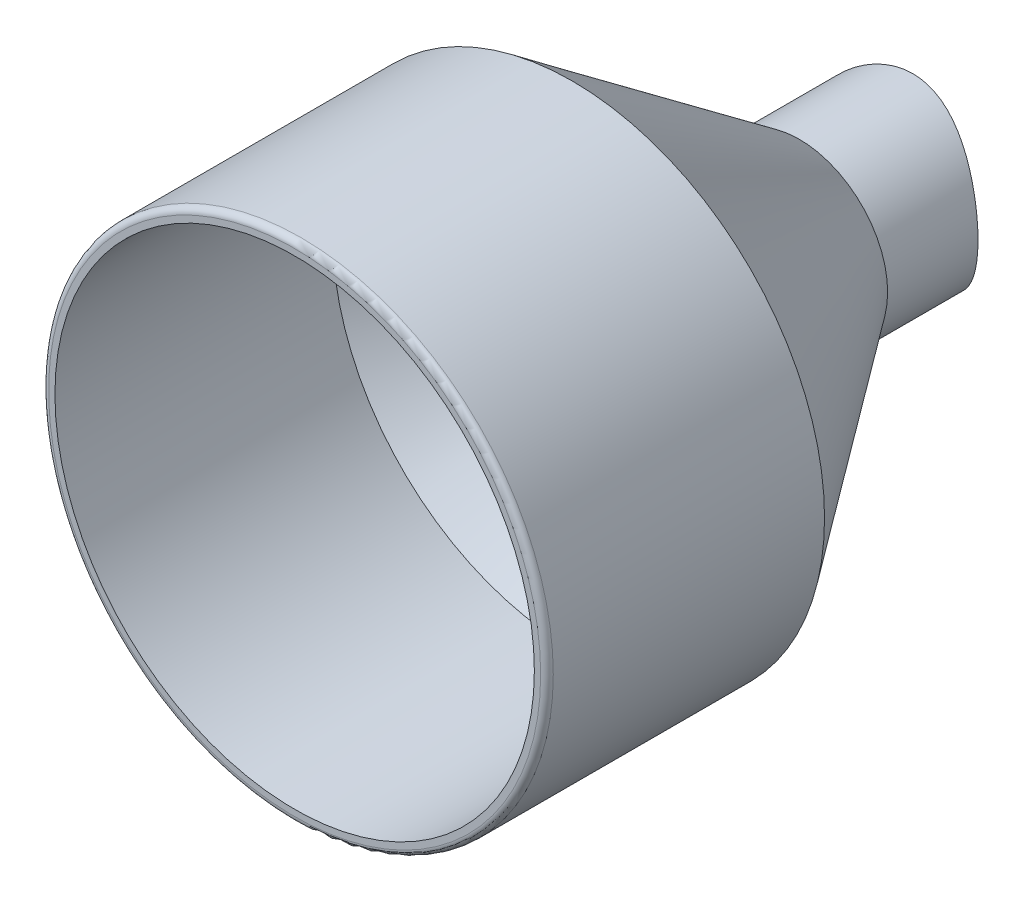
ISO-10303-21;
HEADER;
FILE_DESCRIPTION(('STEP AP214'),'2;1');
FILE_NAME('part.step','',(''),(''),'','','');
FILE_SCHEMA(('AUTOMOTIVE_DESIGN { 1 0 10303 214 1 1 1 1 }'));
ENDSEC;
DATA;
#1=APPLICATION_CONTEXT('core data for automotive mechanical design processes');
#2=APPLICATION_PROTOCOL_DEFINITION('international standard','automotive_design',2000,#1);
#3=PRODUCT_CONTEXT('',#1,'mechanical');
#4=PRODUCT('Part','Part','',(#3));
#5=PRODUCT_RELATED_PRODUCT_CATEGORY('part','',(#4));
#6=PRODUCT_DEFINITION_FORMATION('','',#4);
#7=PRODUCT_DEFINITION_CONTEXT('part definition',#1,'design');
#8=PRODUCT_DEFINITION('design','',#6,#7);
#9=PRODUCT_DEFINITION_SHAPE('','',#8);
#10=(LENGTH_UNIT() NAMED_UNIT(*) SI_UNIT(.MILLI.,.METRE.));
#11=(NAMED_UNIT(*) PLANE_ANGLE_UNIT() SI_UNIT($,.RADIAN.));
#12=(NAMED_UNIT(*) SI_UNIT($,.STERADIAN.) SOLID_ANGLE_UNIT());
#13=UNCERTAINTY_MEASURE_WITH_UNIT(LENGTH_MEASURE(1.E-05),#10,'distance_accuracy_value','');
#14=(GEOMETRIC_REPRESENTATION_CONTEXT(3) GLOBAL_UNCERTAINTY_ASSIGNED_CONTEXT((#13)) GLOBAL_UNIT_ASSIGNED_CONTEXT((#10,
#11,#12)) REPRESENTATION_CONTEXT('',''));
#15=CARTESIAN_POINT('',(0.,0.,0.));
#16=DIRECTION('',(0.,0.,1.));
#17=DIRECTION('',(1.,0.,0.));
#18=AXIS2_PLACEMENT_3D('',#15,#16,#17);
#19=CARTESIAN_POINT('',(0.,0.,0.));
#20=DIRECTION('',(0.,0.,1.));
#21=DIRECTION('',(1.,0.,0.));
#22=AXIS2_PLACEMENT_3D('',#19,#20,#21);
#23=CYLINDRICAL_SURFACE('',#22,6.);
#24=CARTESIAN_POINT('',(0.,0.,-18.));
#25=DIRECTION('',(0.,0.,1.));
#26=DIRECTION('',(1.,0.,0.));
#27=AXIS2_PLACEMENT_3D('',#24,#25,#26);
#28=CIRCLE('',#27,6.);
#29=CARTESIAN_POINT('',(-5.91607978309961,-0.999999999999999,-18.));
#30=VERTEX_POINT('',#29);
#31=CARTESIAN_POINT('',(5.91607978309961,-1.,-18.));
#32=VERTEX_POINT('',#31);
#33=EDGE_CURVE('E230',#30,#32,#28,.T.);
#34=ORIENTED_EDGE('',*,*,#33,.T.);
#35=DIRECTION('',(0.,0.,1.));
#36=VECTOR('',#35,1.);
#37=CARTESIAN_POINT('',(5.91607978309962,-1.,0.));
#38=LINE('',#37,#36);
#39=CARTESIAN_POINT('',(5.91607978309962,-1.,-21.9160797830994));
#40=VERTEX_POINT('',#39);
#41=EDGE_CURVE('E152',#32,#40,#38,.F.);
#42=ORIENTED_EDGE('',*,*,#41,.T.);
#43=CARTESIAN_POINT('',(0.,0.,-15.9999999999998));
#44=DIRECTION('',(0.70710678118655,0.,0.707106781186545));
#45=DIRECTION('',(-0.707106781186545,0.,0.70710678118655));
#46=AXIS2_PLACEMENT_3D('',#43,#44,#45);
#47=ELLIPSE('',#46,8.4852813742386,6.);
#48=CARTESIAN_POINT('',(6.00000000000019,0.,-22.));
#49=VERTEX_POINT('',#48);
#50=EDGE_CURVE('E11',#40,#49,#47,.T.);
#51=ORIENTED_EDGE('',*,*,#50,.T.);
#52=CARTESIAN_POINT('',(0.,0.,-15.9999999999998));
#53=DIRECTION('',(0.70710678118655,0.,0.707106781186545));
#54=DIRECTION('',(-0.707106781186545,0.,0.70710678118655));
#55=AXIS2_PLACEMENT_3D('',#52,#53,#54);
#56=ELLIPSE('',#55,8.4852813742386,6.);
#57=CARTESIAN_POINT('',(5.91607978309962,1.,-21.9160797830994));
#58=VERTEX_POINT('',#57);
#59=EDGE_CURVE('E58',#49,#58,#56,.T.);
#60=ORIENTED_EDGE('',*,*,#59,.T.);
#61=DIRECTION('',(0.,0.,1.));
#62=VECTOR('',#61,1.);
#63=CARTESIAN_POINT('',(5.91607978309962,1.,0.));
#64=LINE('',#63,#62);
#65=CARTESIAN_POINT('',(5.91607978309961,1.,-18.));
#66=VERTEX_POINT('',#65);
#67=EDGE_CURVE('E150',#66,#58,#64,.F.);
#68=ORIENTED_EDGE('',*,*,#67,.F.);
#69=CARTESIAN_POINT('',(-5.91607978309961,1.,-18.));
#70=VERTEX_POINT('',#69);
#71=EDGE_CURVE('E229',#66,#70,#28,.T.);
#72=ORIENTED_EDGE('',*,*,#71,.T.);
#73=DIRECTION('',(0.,0.,1.));
#74=VECTOR('',#73,1.);
#75=CARTESIAN_POINT('',(-5.91607978309962,1.,0.));
#76=LINE('',#75,#74);
#77=CARTESIAN_POINT('',(-5.91607978309962,1.,-21.9160797830994));
#78=VERTEX_POINT('',#77);
#79=EDGE_CURVE('E170',#70,#78,#76,.F.);
#80=ORIENTED_EDGE('',*,*,#79,.T.);
#81=CARTESIAN_POINT('',(0.,0.,-15.9999999999998));
#82=DIRECTION('',(0.707106781186545,0.,-0.70710678118655));
#83=DIRECTION('',(0.70710678118655,0.,0.707106781186545));
#84=AXIS2_PLACEMENT_3D('',#81,#82,#83);
#85=ELLIPSE('',#84,8.48528137423854,6.);
#86=CARTESIAN_POINT('',(-6.0000000000002,0.,-22.));
#87=VERTEX_POINT('',#86);
#88=EDGE_CURVE('E70',#78,#87,#85,.F.);
#89=ORIENTED_EDGE('',*,*,#88,.T.);
#90=CARTESIAN_POINT('',(0.,0.,-15.9999999999998));
#91=DIRECTION('',(0.707106781186545,0.,-0.70710678118655));
#92=DIRECTION('',(0.70710678118655,0.,0.707106781186545));
#93=AXIS2_PLACEMENT_3D('',#90,#91,#92);
#94=ELLIPSE('',#93,8.48528137423854,6.);
#95=CARTESIAN_POINT('',(-5.91607978309962,-0.999999999999999,-21.9160797830994));
#96=VERTEX_POINT('',#95);
#97=EDGE_CURVE('E278',#87,#96,#94,.F.);
#98=ORIENTED_EDGE('',*,*,#97,.T.);
#99=DIRECTION('',(0.,0.,1.));
#100=VECTOR('',#99,1.);
#101=CARTESIAN_POINT('',(-5.91607978309962,-0.999999999999999,0.));
#102=LINE('',#101,#100);
#103=EDGE_CURVE('E166',#30,#96,#102,.F.);
#104=ORIENTED_EDGE('',*,*,#103,.F.);
#105=EDGE_LOOP('',(#34,#42,#51,#60,#68,#72,#80,#89,#98,#104));
#106=FACE_BOUND('',#105,.T.);
#107=CARTESIAN_POINT('',(6.,0.,-25.1621915873063));
#108=CARTESIAN_POINT('',(5.99999888257323,0.160618394721495,-25.1621924892069));
#109=CARTESIAN_POINT('',(5.99354173824392,0.321289035599812,-25.1649145803394));
#110=CARTESIAN_POINT('',(5.96777370903568,0.641484455748276,-25.1757352147799));
#111=CARTESIAN_POINT('',(5.94845481198529,0.801008458073393,-25.1838371094043));
#112=CARTESIAN_POINT('',(5.89711273169944,1.11798337683559,-25.2052252391968));
#113=CARTESIAN_POINT('',(5.86506384340159,1.27542942860917,-25.2185219631379));
#114=CARTESIAN_POINT('',(5.78857746660142,1.58685012186932,-25.2499560807362));
#115=CARTESIAN_POINT('',(5.7441349145943,1.74082331664972,-25.2680954527563));
#116=CARTESIAN_POINT('',(5.64349000112519,2.04361840661437,-25.3086683322806));
#117=CARTESIAN_POINT('',(5.58733365890612,2.19245787995398,-25.3310850072676));
#118=CARTESIAN_POINT('',(5.4636306092057,2.48474093471054,-25.3797105048604));
#119=CARTESIAN_POINT('',(5.39607964159631,2.62818247336909,-25.4059207452508));
#120=CARTESIAN_POINT('',(5.25018391014092,2.90870044118946,-25.4614789078839));
#121=CARTESIAN_POINT('',(5.17184696919005,3.0457813881113,-25.4908245526431));
#122=CARTESIAN_POINT('',(5.00489817164606,3.3129809410029,-25.5519794431593));
#123=CARTESIAN_POINT('',(4.91628258597859,3.44309699494336,-25.5837895816317));
#124=CARTESIAN_POINT('',(4.62720337107324,3.83366084023144,-25.6848521329039));
#125=CARTESIAN_POINT('',(4.41021496961765,4.0813806819033,-25.7570816531876));
#126=CARTESIAN_POINT('',(3.93867576395821,4.53813343285698,-25.9019931919335));
#127=CARTESIAN_POINT('',(3.68410492395575,4.74714557161794,-25.9746754318286));
#128=CARTESIAN_POINT('',(3.27155115657071,5.03258230756573,-26.0800265078064));
#129=CARTESIAN_POINT('',(3.12500305472979,5.12488363137657,-26.1153274431481));
#130=CARTESIAN_POINT('',(2.82395816976248,5.29672182916938,-26.1828396494125));
#131=CARTESIAN_POINT('',(2.66946471609206,5.37626399317016,-26.2150521985571));
#132=CARTESIAN_POINT('',(2.35347944858144,5.52190245446403,-26.2753231511987));
#133=CARTESIAN_POINT('',(2.1919873724393,5.58799824726991,-26.303381398822));
#134=CARTESIAN_POINT('',(1.86320293959396,5.70604582695153,-26.3543327395146));
#135=CARTESIAN_POINT('',(1.69591363653532,5.75800493628933,-26.3772285055687));
#136=CARTESIAN_POINT('',(1.36497441566996,5.84505656806531,-26.4160392656105));
#137=CARTESIAN_POINT('',(1.20154069472106,5.88084414741359,-26.432238667914));
#138=CARTESIAN_POINT('',(0.871848156796185,5.9386760916095,-26.4585959387235));
#139=CARTESIAN_POINT('',(0.705590690680889,5.96072684784478,-26.4687566167901));
#140=CARTESIAN_POINT('',(0.37158988082561,5.9908287838777,-26.4826615560872));
#141=CARTESIAN_POINT('',(0.203846952412823,5.99888375988389,-26.4864075572277));
#142=CARTESIAN_POINT('',(-0.131737395549293,6.0008995803368,-26.4873431339011));
#143=CARTESIAN_POINT('',(-0.299578809252229,5.99486119052214,-26.4845330656467));
#144=CARTESIAN_POINT('',(-0.620727249036738,5.96980389497806,-26.4729447644338));
#145=CARTESIAN_POINT('',(-0.774136246005555,5.95184667719619,-26.4646548830236));
#146=CARTESIAN_POINT('',(-1.07880348065238,5.90423253859485,-26.4428730495754));
#147=CARTESIAN_POINT('',(-1.23006099964038,5.87457179914799,-26.4293793996834));
#148=CARTESIAN_POINT('',(-1.52933353764565,5.80385882262908,-26.3976143249487));
#149=CARTESIAN_POINT('',(-1.67734927552561,5.76280913921561,-26.3793439712039));
#150=CARTESIAN_POINT('',(-1.96932421660252,5.6696784486531,-26.3385605524084));
#151=CARTESIAN_POINT('',(-2.11328182995331,5.61759318433394,-26.3160458503961));
#152=CARTESIAN_POINT('',(-2.39926082527226,5.50162302834155,-26.2669000077499));
#153=CARTESIAN_POINT('',(-2.54117742362295,5.43751254794415,-26.2401920981847));
#154=CARTESIAN_POINT('',(-2.81916924800812,5.29871973177929,-26.1837494809403));
#155=CARTESIAN_POINT('',(-2.95524248248552,5.2240338283464,-26.1540137527681));
#156=CARTESIAN_POINT('',(-3.22084718795343,5.06459661420295,-26.0922941789663));
#157=CARTESIAN_POINT('',(-3.35037767439956,4.97984379502881,-26.0603099967139));
#158=CARTESIAN_POINT('',(-3.60227159990305,4.80078338674564,-25.9948869382663));
#159=CARTESIAN_POINT('',(-3.72463462774758,4.70647525027275,-25.9614479787987));
#160=CARTESIAN_POINT('',(-3.97190577179377,4.50023124980554,-25.8909749997068));
#161=CARTESIAN_POINT('',(-4.09611436849253,4.38747593919586,-25.8538806912834));
#162=CARTESIAN_POINT('',(-4.33465624066508,4.15196824278665,-25.7799178433171));
#163=CARTESIAN_POINT('',(-4.44899234038658,4.02921873570357,-25.7430492420285));
#164=CARTESIAN_POINT('',(-4.66721335912174,3.77429288747005,-25.670474654568));
#165=CARTESIAN_POINT('',(-4.77109177531276,3.64211076713233,-25.6347694010104));
#166=CARTESIAN_POINT('',(-4.96758611954717,3.36917676549167,-25.5654966449016));
#167=CARTESIAN_POINT('',(-5.06020654608414,3.22842834109494,-25.5319282910538));
#168=CARTESIAN_POINT('',(-5.23567474441132,2.93556755749549,-25.4670138714965));
#169=CARTESIAN_POINT('',(-5.31822673111419,2.78326102948591,-25.4357426065437));
#170=CARTESIAN_POINT('',(-5.47007590092039,2.47150122265009,-25.3772594225084));
#171=CARTESIAN_POINT('',(-5.53937847614665,2.31205088389665,-25.3500458530592));
#172=CARTESIAN_POINT('',(-5.66406925926004,1.98710703950235,-25.3004621673943));
#173=CARTESIAN_POINT('',(-5.71946079594547,1.82161499047062,-25.2780908926341));
#174=CARTESIAN_POINT('',(-5.81573825822113,1.48582855126444,-25.2388583251554));
#175=CARTESIAN_POINT('',(-5.85662531218667,1.31553453577179,-25.2219966038296));
#176=CARTESIAN_POINT('',(-5.92126122708215,0.982620194032665,-25.1951936944371));
#177=CARTESIAN_POINT('',(-5.94594324203777,0.820210786394779,-25.1848771445674));
#178=CARTESIAN_POINT('',(-5.98191229661552,0.49366220955641,-25.1698074409961));
#179=CARTESIAN_POINT('',(-5.99320008886445,0.329523138069366,-25.1650539747027));
#180=CARTESIAN_POINT('',(-6.00225133900485,0.000847930234132888,-25.1612440895249));
#181=CARTESIAN_POINT('',(-6.00001814978791,-0.163688097562655,-25.1621862582542));
#182=CARTESIAN_POINT('',(-5.98206092912801,-0.49188870700544,-25.1697379306299));
#183=CARTESIAN_POINT('',(-5.96633720942654,-0.655553308700568,-25.1763473033174));
#184=CARTESIAN_POINT('',(-5.92272643781012,-0.972401134376432,-25.1945680170866));
#185=CARTESIAN_POINT('',(-5.89550306406548,-1.12569210609634,-25.2059060563324));
#186=CARTESIAN_POINT('',(-5.82933220918568,-1.42934954081912,-25.2332386626139));
#187=CARTESIAN_POINT('',(-5.79038091516022,-1.57971503576229,-25.2492347439805));
#188=CARTESIAN_POINT('',(-5.70113145919719,-1.87645963469755,-25.2854885412545));
#189=CARTESIAN_POINT('',(-5.65083650994064,-2.02283985424587,-25.3057450504402));
#190=CARTESIAN_POINT('',(-5.53930448713367,-2.31083577626561,-25.350051799416));
#191=CARTESIAN_POINT('',(-5.47806324440901,-2.45244963884182,-25.3741034842848));
#192=CARTESIAN_POINT('',(-5.34308395499758,-2.73434086314345,-25.4262324598577));
#193=CARTESIAN_POINT('',(-5.26901948190859,-2.8744431569949,-25.454410812225));
#194=CARTESIAN_POINT('',(-5.11031466707195,-3.14796687789442,-25.5135444259671));
#195=CARTESIAN_POINT('',(-5.02567070937933,-3.2813859987666,-25.544500635756));
#196=CARTESIAN_POINT('',(-4.84637621523083,-3.54083427912253,-25.6084656889157));
#197=CARTESIAN_POINT('',(-4.75172387000061,-3.66686209638643,-25.6414749028718));
#198=CARTESIAN_POINT('',(-4.55299091707716,-3.91088708997672,-25.7087801278021));
#199=CARTESIAN_POINT('',(-4.44890983939863,-4.02888386547321,-25.7430762028713));
#200=CARTESIAN_POINT('',(-4.22394285067534,-4.26459297728537,-25.8146915355818));
#201=CARTESIAN_POINT('',(-4.10238459583844,-4.38165311514307,-25.8520484233736));
#202=CARTESIAN_POINT('',(-3.84980881751118,-4.60514942627173,-25.9263113821488));
#203=CARTESIAN_POINT('',(-3.71879416817123,-4.71158880434963,-25.9632175861577));
#204=CARTESIAN_POINT('',(-3.44790959463138,-4.91329338653297,-26.0355874421849));
#205=CARTESIAN_POINT('',(-3.30803400785155,-5.00855133193964,-26.0710501474713));
#206=CARTESIAN_POINT('',(-3.02034501474886,-5.18711534327722,-26.1394573032266));
#207=CARTESIAN_POINT('',(-2.87253496321531,-5.27042640663928,-26.1724028039427));
#208=CARTESIAN_POINT('',(-2.56734291931278,-5.42572879108832,-26.2352760733726));
#209=CARTESIAN_POINT('',(-2.40984505419947,-5.49751604118815,-26.2651466503623));
#210=CARTESIAN_POINT('',(-2.08859007123571,-5.62741458469705,-26.320221326049));
#211=CARTESIAN_POINT('',(-1.92483571315456,-5.68553182886954,-26.3454274542292));
#212=CARTESIAN_POINT('',(-1.59227196867133,-5.78747795773815,-26.3902599608757));
#213=CARTESIAN_POINT('',(-1.42346505992841,-5.83131372436167,-26.40988902622));
#214=CARTESIAN_POINT('',(-1.08208515385563,-5.90419726271519,-26.4428214668439));
#215=CARTESIAN_POINT('',(-0.909512523154297,-5.93324646741631,-26.4561254550809));
#216=CARTESIAN_POINT('',(-0.57571514487457,-5.97449411311304,-26.475098034296));
#217=CARTESIAN_POINT('',(-0.414659915951917,-5.98783389817642,-26.4812829236631));
#218=CARTESIAN_POINT('',(-0.0918824167973524,-6.00147028787072,-26.4876059575911));
#219=CARTESIAN_POINT('',(0.0698398183627695,-6.00176756976011,-26.4877444161252));
#220=CARTESIAN_POINT('',(0.392645863967104,-5.98931690970327,-26.4819700697026));
#221=CARTESIAN_POINT('',(0.553729764536217,-5.97657088034601,-26.476058151935));
#222=CARTESIAN_POINT('',(0.874026699084269,-5.938189355622,-26.4583947693117));
#223=CARTESIAN_POINT('',(1.03323975001881,-5.91255397716444,-26.4466433574215));
#224=CARTESIAN_POINT('',(1.3409017611149,-5.85024812984096,-26.4184160557315));
#225=CARTESIAN_POINT('',(1.48949670585988,-5.81417763803819,-26.4021988859659));
#226=CARTESIAN_POINT('',(1.78303863127114,-5.73097339915315,-26.3653332215793));
#227=CARTESIAN_POINT('',(1.92798441704062,-5.68383607915427,-26.3446832960314));
#228=CARTESIAN_POINT('',(2.21333163801387,-5.57891231254692,-26.2995452057887));
#229=CARTESIAN_POINT('',(2.35373366980137,-5.5211272706818,-26.2750575474659));
#230=CARTESIAN_POINT('',(2.62929521173578,-5.39534758087854,-26.2229020794061));
#231=CARTESIAN_POINT('',(2.76445278856944,-5.32734921206336,-26.1952331115328));
#232=CARTESIAN_POINT('',(3.17700913232949,-5.09989962007943,-26.1050059804287));
#233=CARTESIAN_POINT('',(3.44422844864841,-4.92329860741105,-26.0380710826127));
#234=CARTESIAN_POINT('',(3.94663247775839,-4.53054583896789,-25.8999805259257));
#235=CARTESIAN_POINT('',(4.18180565589542,-4.31437990749146,-25.828823360455));
#236=CARTESIAN_POINT('',(4.51499133633917,-3.955281964872,-25.7214831498572));
#237=CARTESIAN_POINT('',(4.62618347832409,-3.82464302959067,-25.6843271696962));
#238=CARTESIAN_POINT('',(4.83717405390478,-3.55403329044994,-25.6117953300013));
#239=CARTESIAN_POINT('',(4.93697658268199,-3.41406586954012,-25.5764188332218));
#240=CARTESIAN_POINT('',(5.12455356492543,-3.12547624944686,-25.5083827124174));
#241=CARTESIAN_POINT('',(5.21231673910645,-2.97684611766543,-25.4757256472434));
#242=CARTESIAN_POINT('',(5.37494445891248,-2.67203875785514,-25.4140893424782));
#243=CARTESIAN_POINT('',(5.44981494500601,-2.51586504832972,-25.385108410692));
#244=CARTESIAN_POINT('',(5.58495449988672,-2.19941546977564,-25.3320490769435));
#245=CARTESIAN_POINT('',(5.64542998715473,-2.03923931480148,-25.307902273226));
#246=CARTESIAN_POINT('',(5.75259885771387,-1.71375128788139,-25.2646657110172));
#247=CARTESIAN_POINT('',(5.79929879341985,-1.54844189907738,-25.245573548703));
#248=CARTESIAN_POINT('',(5.87833572421284,-1.21431980381375,-25.2130353914309));
#249=CARTESIAN_POINT('',(5.91070802177085,-1.04551679300169,-25.1995755233444));
#250=CARTESIAN_POINT('',(5.96085587832045,-0.705474528202967,-25.1786474632555));
#251=CARTESIAN_POINT('',(5.97864206248944,-0.534237140196967,-25.1711749099166));
#252=CARTESIAN_POINT('',(5.99269030885473,-0.302197952350929,-25.1652679980522));
#253=CARTESIAN_POINT('',(5.99543065738449,-0.241799227883774,-25.1641150061289));
#254=CARTESIAN_POINT('',(5.99908571696554,-0.120936137703109,-25.1625766294387));
#255=CARTESIAN_POINT('',(6.00000042070385,-0.0604717717276298,-25.1621912477467));
#256=CARTESIAN_POINT('',(6.,0.,-25.1621915873063));
#257=B_SPLINE_CURVE_WITH_KNOTS('',3,(#107,#108,#109,#110,#111,#112,#113,#114,#115,#116,#117,
#118,#119,#120,#121,#122,#123,#124,#125,#126,#127,#128,#129,#130,#131,#132,#133,#134,#135,#136,
#137,#138,#139,#140,#141,#142,#143,#144,#145,#146,#147,#148,#149,#150,#151,#152,#153,#154,#155,
#156,#157,#158,#159,#160,#161,#162,#163,#164,#165,#166,#167,#168,#169,#170,#171,#172,#173,#174,
#175,#176,#177,#178,#179,#180,#181,#182,#183,#184,#185,#186,#187,#188,#189,#190,#191,#192,#193,
#194,#195,#196,#197,#198,#199,#200,#201,#202,#203,#204,#205,#206,#207,#208,#209,#210,#211,#212,
#213,#214,#215,#216,#217,#218,#219,#220,#221,#222,#223,#224,#225,#226,#227,#228,#229,#230,#231,
#232,#233,#234,#235,#236,#237,#238,#239,#240,#241,#242,#243,#244,#245,#246,#247,#248,#249,#250,
#251,#252,#253,#254,#255,#256),.UNSPECIFIED.,.T.,.F.,(4,2,2,2,2,2,2,2,2,2,2,2,2,2,2,2,2,2,2,2,2,
2,2,2,2,2,2,2,2,2,2,2,2,2,2,2,2,2,2,2,2,2,2,2,2,2,2,2,2,2,2,2,2,2,2,2,2,2,2,2,2,2,2,2,2,2,2,2,2,
2,2,2,2,2,4),(0.,0.481793787115834,0.963887986702552,1.44696064555644,1.93023095648585,
2.411637273441,2.89322397514694,3.37446321175308,3.85587759044769,4.86265673054637,
5.86997455198099,6.39967387648899,6.92915301386807,7.45865201282982,7.98787621961926,
8.49146668244346,8.99482266234038,9.49804209088331,10.0012341785069,10.4647267579433,
10.9283706910501,11.3919107486116,11.855629951578,12.3291242356415,12.8027786373409,
13.2765041029023,13.7502567205663,14.2650935644978,14.7797826365255,15.2947898022038,
15.8095904988607,16.3370311289759,16.8642566471052,17.3913558839923,17.9184141062304,
18.4115729311591,18.9047040439818,19.3977128766698,19.8907103171317,20.358477142414,
20.8263962089222,21.2941829202757,21.7621481812309,22.2445064348996,22.727030006177,
23.2096409314696,23.6922759262731,24.2102156745484,24.72799865921,25.2461159377579,
25.7640158494698,26.2902623846951,26.816279410994,27.3420425851433,27.8677547976862,
28.3523026008932,28.8368252429413,29.3212768478217,29.8057240587006,30.2665153759395,
30.7274556643561,31.1883351848622,31.6493830201894,32.6266547951157,33.6042774042976,
34.130332464775,34.6561977801018,35.1825524453565,35.7086639333333,36.2267026932479,
36.7444946464434,37.2610035894312,37.7771359491564,37.9585274221562,38.1399196217531),.UNSPECIFIED.);
#258=CARTESIAN_POINT('',(6.,0.,-25.1621915873063));
#259=VERTEX_POINT('',#258);
#260=EDGE_CURVE('E172',#259,#259,#257,.T.);
#261=ORIENTED_EDGE('',*,*,#260,.F.);
#262=EDGE_LOOP('',(#261));
#263=FACE_BOUND('',#262,.T.);
#264=ADVANCED_FACE('F49',(#106,#263),#23,.F.);
#265=CARTESIAN_POINT('',(0.,0.,0.));
#266=DIRECTION('',(0.,0.,1.));
#267=DIRECTION('',(1.,0.,0.));
#268=AXIS2_PLACEMENT_3D('',#265,#266,#267);
#269=CYLINDRICAL_SURFACE('',#268,7.);
#270=CARTESIAN_POINT('',(0.,0.,-18.));
#271=DIRECTION('',(0.,0.,1.));
#272=DIRECTION('',(1.,0.,0.));
#273=AXIS2_PLACEMENT_3D('',#270,#271,#272);
#274=CIRCLE('',#273,7.);
#275=CARTESIAN_POINT('',(7.,0.,-18.));
#276=VERTEX_POINT('',#275);
#277=EDGE_CURVE('E223',#276,#276,#274,.T.);
#278=ORIENTED_EDGE('',*,*,#277,.F.);
#279=EDGE_LOOP('',(#278));
#280=FACE_BOUND('',#279,.T.);
#281=CARTESIAN_POINT('',(0.,7.00000000000018,-27.));
#282=CARTESIAN_POINT('',(-0.182957806975727,6.99999897547508,-26.9999986886827));
#283=CARTESIAN_POINT('',(-0.365937403076251,6.99281736130515,-26.9959408494774));
#284=CARTESIAN_POINT('',(-0.730496169201662,6.96418208123113,-26.9798575248853));
#285=CARTESIAN_POINT('',(-0.912074612894971,6.94272145816514,-26.9678281555412));
#286=CARTESIAN_POINT('',(-1.2726507814891,6.88576273342859,-26.9362214547992));
#287=CARTESIAN_POINT('',(-1.45164378800497,6.85024167842352,-26.916631782694));
#288=CARTESIAN_POINT('',(-1.80554607432146,6.76558419496202,-26.8705932905129));
#289=CARTESIAN_POINT('',(-1.98045355010654,6.71644187064965,-26.8441415005434));
#290=CARTESIAN_POINT('',(-2.32404054906827,6.60539477727641,-26.7854273557382));
#291=CARTESIAN_POINT('',(-2.49274969539304,6.54356374336255,-26.7531987018785));
#292=CARTESIAN_POINT('',(-2.82408771977422,6.4075458589054,-26.6838104440154));
#293=CARTESIAN_POINT('',(-2.98671421931901,6.33335423556397,-26.6466489364187));
#294=CARTESIAN_POINT('',(-3.46410862668851,6.09316611887709,-26.5293522596935));
#295=CARTESIAN_POINT('',(-3.76872799322188,5.90944646344311,-26.4433440189273));
#296=CARTESIAN_POINT('',(-4.36815154354682,5.48318362298563,-26.2571364716684));
#297=CARTESIAN_POINT('',(-4.66025259478686,5.23712636507598,-26.1563525908394));
#298=CARTESIAN_POINT('',(-5.20127844823751,4.70018742018018,-25.956613651358));
#299=CARTESIAN_POINT('',(-5.4501823422764,4.40928415486391,-25.8576594989136));
#300=CARTESIAN_POINT('',(-5.793685567927,3.93381121636027,-25.7148357114364));
#301=CARTESIAN_POINT('',(-5.90605321596001,3.76304498682515,-25.6668265803826));
#302=CARTESIAN_POINT('',(-6.11586871545516,3.41145103173321,-25.5753774392804));
#303=CARTESIAN_POINT('',(-6.21332290367891,3.23062762427275,-25.5319354910956));
#304=CARTESIAN_POINT('',(-6.39235749384011,2.86008840317237,-25.4508748418813));
#305=CARTESIAN_POINT('',(-6.47394153818342,2.67037464241805,-25.4132548050531));
#306=CARTESIAN_POINT('',(-6.62034561154186,2.28337586039313,-25.344950219327));
#307=CARTESIAN_POINT('',(-6.68516734924687,2.08609161318727,-25.3142649635624));
#308=CARTESIAN_POINT('',(-6.79334801195052,1.69938446329013,-25.2626339993837));
#309=CARTESIAN_POINT('',(-6.83788004794211,1.51035962638368,-25.2411620058716));
#310=CARTESIAN_POINT('',(-6.91115588833501,1.12858160518104,-25.2056598010453));
#311=CARTESIAN_POINT('',(-6.93990035919214,0.935828578622192,-25.1916292755981));
#312=CARTESIAN_POINT('',(-6.98121367669525,0.548281933423637,-25.1714219551682));
#313=CARTESIAN_POINT('',(-6.99379044731499,0.353489361619496,-25.1652413128864));
#314=CARTESIAN_POINT('',(-7.00262157421757,-0.0365500547632827,-25.1609042060966));
#315=CARTESIAN_POINT('',(-6.99887688396689,-0.231796872139844,-25.1627472728599));
#316=CARTESIAN_POINT('',(-6.97612449781331,-0.604626993150835,-25.1739076378591));
#317=CARTESIAN_POINT('',(-6.95843028832179,-0.782311616157891,-25.1825816610068));
#318=CARTESIAN_POINT('',(-6.90959783735846,-1.13544642582217,-25.2063974529253));
#319=CARTESIAN_POINT('',(-6.87845503114082,-1.31089583296355,-25.2215414177162));
#320=CARTESIAN_POINT('',(-6.80307344887204,-1.65824182900574,-25.2579264887993));
#321=CARTESIAN_POINT('',(-6.75883923546341,-1.83013963342505,-25.2791654707662));
#322=CARTESIAN_POINT('',(-6.65769862570609,-2.16942432135046,-25.3272537769115));
#323=CARTESIAN_POINT('',(-6.60078730398859,-2.3368094231472,-25.3541052814424));
#324=CARTESIAN_POINT('',(-6.47395202397873,-2.66830768150953,-25.4132144719241));
#325=CARTESIAN_POINT('',(-6.40385970334112,-2.83234406604418,-25.4455414971491));
#326=CARTESIAN_POINT('',(-6.2517826745092,-3.15386642335523,-25.5146122065581));
#327=CARTESIAN_POINT('',(-6.16979395621284,-3.31135016420558,-25.5513573793165));
#328=CARTESIAN_POINT('',(-5.9069148200452,-3.7727380089355,-25.6670375762751));
#329=CARTESIAN_POINT('',(-5.70903558913878,-4.06577521508644,-25.7514537568071));
#330=CARTESIAN_POINT('',(-5.25275153207093,-4.64285723094897,-25.9360458796941));
#331=CARTESIAN_POINT('',(-4.99045159887072,-4.92359029031823,-26.0369572363125));
#332=CARTESIAN_POINT('',(-4.56540488138693,-5.30978735567258,-26.1876735015548));
#333=CARTESIAN_POINT('',(-4.41833905239788,-5.43277867853638,-26.2378397282015));
#334=CARTESIAN_POINT('',(-4.11423602126707,-5.66655295020354,-26.3366894013261));
#335=CARTESIAN_POINT('',(-3.95719729860382,-5.77733403028945,-26.3853726200143));
#336=CARTESIAN_POINT('',(-3.62422142526221,-5.99221245225355,-26.4827430172549));
#337=CARTESIAN_POINT('',(-3.44771570663498,-6.09550926812534,-26.5312549722043));
#338=CARTESIAN_POINT('',(-3.08541881097416,-6.28666151857386,-26.6234603702677));
#339=CARTESIAN_POINT('',(-2.89963186445965,-6.37452390737648,-26.6671559801392));
#340=CARTESIAN_POINT('',(-2.51994869562031,-6.53392861692989,-26.748137216865));
#341=CARTESIAN_POINT('',(-2.32605716566193,-6.60548023051342,-26.7854264906398));
#342=CARTESIAN_POINT('',(-1.93146661519693,-6.73144187542298,-26.8521246334104));
#343=CARTESIAN_POINT('',(-1.73076849240471,-6.78585415757406,-26.8815345370897));
#344=CARTESIAN_POINT('',(-1.34015012033759,-6.87319865491972,-26.9292464822077));
#345=CARTESIAN_POINT('',(-1.15061512892647,-6.90747835171,-26.9482375529786));
#346=CARTESIAN_POINT('',(-0.768706831083227,-6.960333415649,-26.9776758535897));
#347=CARTESIAN_POINT('',(-0.576333681987263,-6.97890965003163,-26.9881235552421));
#348=CARTESIAN_POINT('',(-0.190539011764173,-7.00007122416835,-27.0000341872012));
#349=CARTESIAN_POINT('',(0.00288186410680259,-7.00266548569128,-27.0015021303608));
#350=CARTESIAN_POINT('',(0.389124663262615,-6.99184525542565,-26.9954029375839));
#351=CARTESIAN_POINT('',(0.581946622973794,-6.9784317571385,-26.9878363623634));
#352=CARTESIAN_POINT('',(0.945298776399229,-6.93803050138765,-26.9652362703616));
#353=CARTESIAN_POINT('',(1.11605921770747,-6.91260187136993,-26.9510624395788));
#354=CARTESIAN_POINT('',(1.45464850496667,-6.84935517719821,-26.9161867208173));
#355=CARTESIAN_POINT('',(1.6224763570009,-6.81153299522029,-26.8954826632214));
#356=CARTESIAN_POINT('',(1.95408983338791,-6.72390841933843,-26.8481942651152));
#357=CARTESIAN_POINT('',(2.11787602590936,-6.67410772005226,-26.8216107564219));
#358=CARTESIAN_POINT('',(2.44060986527794,-6.5629692377508,-26.7633232638492));
#359=CARTESIAN_POINT('',(2.59955559912767,-6.5016269604103,-26.7316172859469));
#360=CARTESIAN_POINT('',(2.91897974300712,-6.36483443527657,-26.6623867569569));
#361=CARTESIAN_POINT('',(3.07919203562723,-6.28886483279544,-26.6246615768059));
#362=CARTESIAN_POINT('',(3.39274461958077,-6.12540260177739,-26.5455608424138));
#363=CARTESIAN_POINT('',(3.54608257465352,-6.03790609499095,-26.5041840611379));
#364=CARTESIAN_POINT('',(3.84523757113612,-5.85193774354405,-26.418816650301));
#365=CARTESIAN_POINT('',(3.99105272571921,-5.75346316481299,-26.3748253708829));
#366=CARTESIAN_POINT('',(4.27455600766192,-5.54608161660102,-26.285263665842));
#367=CARTESIAN_POINT('',(4.41224361213528,-5.43717397708841,-26.239693138917));
#368=CARTESIAN_POINT('',(4.69510729444059,-5.19563419956195,-26.1424206566052));
#369=CARTESIAN_POINT('',(4.83917100389882,-5.0617261786826,-26.0906444875016));
#370=CARTESIAN_POINT('',(5.11559950220837,-4.78218280975219,-25.9877585063461));
#371=CARTESIAN_POINT('',(5.24796749704556,-4.63655069651537,-25.9366485149793));
#372=CARTESIAN_POINT('',(5.50036504266189,-4.33414312452475,-25.8363640392141));
#373=CARTESIAN_POINT('',(5.62038587335831,-4.17735992079428,-25.7871909376491));
#374=CARTESIAN_POINT('',(5.84711342241008,-3.85360888191547,-25.6921096790731));
#375=CARTESIAN_POINT('',(5.95382581225865,-3.68664543063479,-25.6462001348836));
#376=CARTESIAN_POINT('',(6.15549951057443,-3.33932510050404,-25.5577964533684));
#377=CARTESIAN_POINT('',(6.25012408947569,-3.15874513873913,-25.5154084792867));
#378=CARTESIAN_POINT('',(6.42362616527154,-2.78903213467496,-25.436516147118));
#379=CARTESIAN_POINT('',(6.50251104170498,-2.59990315183088,-25.4000090333514));
#380=CARTESIAN_POINT('',(6.6436665726303,-2.21445185851481,-25.3339489763496));
#381=CARTESIAN_POINT('',(6.7059445658203,-2.01813276916894,-25.3043929620587));
#382=CARTESIAN_POINT('',(6.81312937480915,-1.6198116766424,-25.2531304610077));
#383=CARTESIAN_POINT('',(6.85803816247331,-1.41781032134432,-25.2314230832376));
#384=CARTESIAN_POINT('',(6.92663741859204,-1.02821965616805,-25.1981142251124));
#385=CARTESIAN_POINT('',(6.95186996478507,-0.840963130234065,-25.1857808417258));
#386=CARTESIAN_POINT('',(6.98711420379384,-0.464686267198405,-25.1685254160211));
#387=CARTESIAN_POINT('',(6.99712684354791,-0.275666040565349,-25.1636029126198));
#388=CARTESIAN_POINT('',(7.00180285740282,0.102555586614895,-25.1613060076852));
#389=CARTESIAN_POINT('',(6.99647050524544,0.291756922049019,-25.1639295045114));
#390=CARTESIAN_POINT('',(6.97053448052296,0.668853158917347,-25.1766472483372));
#391=CARTESIAN_POINT('',(6.94993118157714,0.85674809220049,-25.1867413125617));
#392=CARTESIAN_POINT('',(6.89547370723979,1.21807751763629,-25.2132644103073));
#393=CARTESIAN_POINT('',(6.86252777174868,1.39168206305938,-25.2292582806384));
#394=CARTESIAN_POINT('',(6.78377904277066,1.7353469306478,-25.267193630359));
#395=CARTESIAN_POINT('',(6.73797184918472,1.90540601841194,-25.289137145155));
#396=CARTESIAN_POINT('',(6.63396900507811,2.24082091638889,-25.338458939225));
#397=CARTESIAN_POINT('',(6.57577691662571,2.40617806347647,-25.365835655682));
#398=CARTESIAN_POINT('',(6.44749347909983,2.73137273516071,-25.425431891131));
#399=CARTESIAN_POINT('',(6.37739750159366,2.89120808358724,-25.4576532932577));
#400=CARTESIAN_POINT('',(6.22259295605418,3.21127474496036,-25.5277329407793));
#401=CARTESIAN_POINT('',(6.13738318879825,3.37122369266095,-25.5657748153469));
#402=CARTESIAN_POINT('',(5.95527572237601,3.68339185148787,-25.645524512057));
#403=CARTESIAN_POINT('',(5.85837403431805,3.83560839926736,-25.6872335840003));
#404=CARTESIAN_POINT('',(5.55110350529084,4.27956987544939,-25.8165085824416));
#405=CARTESIAN_POINT('',(5.32409276785063,4.55878356885769,-25.9082580305014));
#406=CARTESIAN_POINT('',(4.80683906477605,5.10379438441732,-26.1040884331512));
#407=CARTESIAN_POINT('',(4.51260987780186,5.36570261104678,-26.2085054559687));
#408=CARTESIAN_POINT('',(4.04053946555802,5.71951447878434,-26.3597507829603));
#409=CARTESIAN_POINT('',(3.87791558373759,5.83101871647764,-26.409307609319));
#410=CARTESIAN_POINT('',(3.5430782845812,6.04032703699602,-26.5052096837865));
#411=CARTESIAN_POINT('',(3.37086359468197,6.13812929568253,-26.5515545038682));
#412=CARTESIAN_POINT('',(3.01307266400431,6.32162136222898,-26.6407272821486));
#413=CARTESIAN_POINT('',(2.82726214941231,6.4069168322634,-26.6834278820083));
#414=CARTESIAN_POINT('',(2.44777162108557,6.56127574592182,-26.76230321527));
#415=CARTESIAN_POINT('',(2.25409571222061,6.63034753201688,-26.7984813004163));
#416=CARTESIAN_POINT('',(1.86070420643987,6.75129743083414,-26.862802341797));
#417=CARTESIAN_POINT('',(1.66100571555136,6.80322000366855,-26.890966048975));
#418=CARTESIAN_POINT('',(1.25686594656347,6.88933363041087,-26.9381380715534));
#419=CARTESIAN_POINT('',(1.05242813273672,6.9235372342634,-26.9571528662396));
#420=CARTESIAN_POINT('',(0.706379284101908,6.96570144443951,-26.9807047716271));
#421=CARTESIAN_POINT('',(0.565524517458492,6.97855259533018,-26.987925098011));
#422=CARTESIAN_POINT('',(0.283117544889738,6.99570254223018,-26.997573372358));
#423=CARTESIAN_POINT('',(0.141565295056126,7.00000079273595,-27.0000010146439));
#424=CARTESIAN_POINT('',(0.,7.00000000000018,-27.));
#425=B_SPLINE_CURVE_WITH_KNOTS('',3,(#281,#282,#283,#284,#285,#286,#287,#288,#289,#290,#291,
#292,#293,#294,#295,#296,#297,#298,#299,#300,#301,#302,#303,#304,#305,#306,#307,#308,#309,#310,
#311,#312,#313,#314,#315,#316,#317,#318,#319,#320,#321,#322,#323,#324,#325,#326,#327,#328,#329,
#330,#331,#332,#333,#334,#335,#336,#337,#338,#339,#340,#341,#342,#343,#344,#345,#346,#347,#348,
#349,#350,#351,#352,#353,#354,#355,#356,#357,#358,#359,#360,#361,#362,#363,#364,#365,#366,#367,
#368,#369,#370,#371,#372,#373,#374,#375,#376,#377,#378,#379,#380,#381,#382,#383,#384,#385,#386,
#387,#388,#389,#390,#391,#392,#393,#394,#395,#396,#397,#398,#399,#400,#401,#402,#403,#404,#405,
#406,#407,#408,#409,#410,#411,#412,#413,#414,#415,#416,#417,#418,#419,#420,#421,#422,#423,#424),
.UNSPECIFIED.,.T.,.F.,(4,2,2,2,2,2,2,2,2,2,2,2,2,2,2,2,2,2,2,2,2,2,2,2,2,2,2,2,2,2,2,2,2,2,2,2,
2,2,2,2,2,2,2,2,2,2,2,2,2,2,2,2,2,2,2,2,2,2,2,2,2,2,2,2,2,2,2,2,2,2,2,4),(0.,0.548727098583846,
1.09772174945845,1.64761634238553,2.1977493254163,2.74477163695142,3.29200566200884,
4.38540787247994,5.56568965308043,6.74654112682553,7.37580339326181,8.00479753792757,
8.63364714942918,9.26243263294712,9.84779205983833,10.4331267744845,11.0181745004187,
11.6031880495152,12.1388774688877,12.6747488559736,13.2104336996222,13.7463270341708,
14.2895981900243,14.8330529019365,15.9193281138522,17.1056128491501,17.6996123507564,
18.2937026351951,18.9234588468201,19.5529305799244,20.1820427790847,20.8110723255211,
21.3908882588806,21.9706721694364,22.5501323923506,23.1295566536676,23.6486385101007,
24.1678930094297,24.6870740922529,25.2064577657482,25.7497446446098,26.2932147824701,
26.8368205743202,27.3804613010386,27.9899370220063,28.599245154066,29.208980692702,
29.8184554934865,30.442312792734,31.0658769064272,31.6891650043878,32.3123823218403,
32.8796906697708,33.4469637199807,34.0140787939665,34.5811799933618,35.112852472369,
35.6447070694961,36.1764089040562,36.708317948573,37.2632521981916,37.8183763109747,
38.9280957858124,40.1448056887773,40.7541606781163,41.3635967136923,41.9893473238592,
42.6147754554063,43.2385691704763,43.8619204604289,44.2864760500638,44.7110587169659),.UNSPECIFIED.);
#426=CARTESIAN_POINT('',(0.,7.00000000000018,-27.));
#427=VERTEX_POINT('',#426);
#428=EDGE_CURVE('E196',#427,#427,#425,.T.);
#429=ORIENTED_EDGE('',*,*,#428,.T.);
#430=EDGE_LOOP('',(#429));
#431=FACE_BOUND('',#430,.T.);
#432=ADVANCED_FACE('F207',(#280,#431),#269,.T.);
#433=CARTESIAN_POINT('',(0.,0.,22.));
#434=DIRECTION('',(0.,0.,1.));
#435=DIRECTION('',(1.,0.,0.));
#436=AXIS2_PLACEMENT_3D('',#433,#434,#435);
#437=PLANE('',#436);
#438=CARTESIAN_POINT('',(0.,0.,22.));
#439=DIRECTION('',(0.,0.,1.));
#440=DIRECTION('',(1.,0.,0.));
#441=AXIS2_PLACEMENT_3D('',#438,#439,#440);
#442=CIRCLE('',#441,19.5);
#443=CARTESIAN_POINT('',(19.5,0.,22.));
#444=VERTEX_POINT('',#443);
#445=EDGE_CURVE('E240',#444,#444,#442,.T.);
#446=ORIENTED_EDGE('',*,*,#445,.T.);
#447=EDGE_LOOP('',(#446));
#448=FACE_BOUND('',#447,.T.);
#449=CARTESIAN_POINT('',(0.,0.,22.));
#450=DIRECTION('',(0.,0.,1.));
#451=DIRECTION('',(1.,0.,0.));
#452=AXIS2_PLACEMENT_3D('',#449,#450,#451);
#453=CIRCLE('',#452,19.);
#454=CARTESIAN_POINT('',(19.,0.,22.));
#455=VERTEX_POINT('',#454);
#456=EDGE_CURVE('E237',#455,#455,#453,.T.);
#457=ORIENTED_EDGE('',*,*,#456,.F.);
#458=EDGE_LOOP('',(#457));
#459=FACE_BOUND('',#458,.T.);
#460=ADVANCED_FACE('F210',(#448,#459),#437,.T.);
#461=CARTESIAN_POINT('',(0.,0.,22.));
#462=DIRECTION('',(0.,0.,-1.));
#463=DIRECTION('',(-1.,0.,0.));
#464=AXIS2_PLACEMENT_3D('',#461,#462,#463);
#465=CYLINDRICAL_SURFACE('',#464,20.);
#466=CARTESIAN_POINT('',(0.,0.,21.5));
#467=DIRECTION('',(0.,0.,1.));
#468=DIRECTION('',(1.,0.,0.));
#469=AXIS2_PLACEMENT_3D('',#466,#467,#468);
#470=CIRCLE('',#469,20.);
#471=CARTESIAN_POINT('',(20.,0.,21.5));
#472=VERTEX_POINT('',#471);
#473=EDGE_CURVE('E204',#472,#472,#470,.F.);
#474=ORIENTED_EDGE('',*,*,#473,.T.);
#475=EDGE_LOOP('',(#474));
#476=FACE_BOUND('',#475,.T.);
#477=CARTESIAN_POINT('',(0.,0.,0.));
#478=DIRECTION('',(0.,0.,1.));
#479=DIRECTION('',(1.,0.,0.));
#480=AXIS2_PLACEMENT_3D('',#477,#478,#479);
#481=CIRCLE('',#480,20.);
#482=CARTESIAN_POINT('',(20.,0.,0.));
#483=VERTEX_POINT('',#482);
#484=EDGE_CURVE('E180',#483,#483,#481,.T.);
#485=ORIENTED_EDGE('',*,*,#484,.T.);
#486=EDGE_LOOP('',(#485));
#487=FACE_BOUND('',#486,.T.);
#488=ADVANCED_FACE('F216',(#476,#487),#465,.T.);
#489=CARTESIAN_POINT('',(0.,0.,22.));
#490=DIRECTION('',(0.,0.,-1.));
#491=DIRECTION('',(-1.,0.,0.));
#492=AXIS2_PLACEMENT_3D('',#489,#490,#491);
#493=CYLINDRICAL_SURFACE('',#492,19.);
#494=ORIENTED_EDGE('',*,*,#456,.T.);
#495=EDGE_LOOP('',(#494));
#496=FACE_BOUND('',#495,.T.);
#497=CARTESIAN_POINT('',(0.,0.,0.));
#498=DIRECTION('',(0.,0.,1.));
#499=DIRECTION('',(1.,0.,0.));
#500=AXIS2_PLACEMENT_3D('',#497,#498,#499);
#501=CIRCLE('',#500,19.);
#502=CARTESIAN_POINT('',(19.,0.,0.));
#503=VERTEX_POINT('',#502);
#504=EDGE_CURVE('E236',#503,#503,#501,.T.);
#505=ORIENTED_EDGE('',*,*,#504,.F.);
#506=EDGE_LOOP('',(#505));
#507=FACE_BOUND('',#506,.T.);
#508=ADVANCED_FACE('F253',(#496,#507),#493,.F.);
#509=CARTESIAN_POINT('',(0.,0.,21.5));
#510=DIRECTION('',(0.,0.,1.));
#511=DIRECTION('',(1.,0.,0.));
#512=AXIS2_PLACEMENT_3D('',#509,#510,#511);
#513=TOROIDAL_SURFACE('',#512,19.5,0.5);
#514=ORIENTED_EDGE('',*,*,#473,.F.);
#515=EDGE_LOOP('',(#514));
#516=FACE_BOUND('',#515,.T.);
#517=ORIENTED_EDGE('',*,*,#445,.F.);
#518=EDGE_LOOP('',(#517));
#519=FACE_BOUND('',#518,.T.);
#520=ADVANCED_FACE('F249',(#516,#519),#513,.T.);
#521=CARTESIAN_POINT('',(0.,0.,0.));
#522=DIRECTION('',(0.,0.,1.));
#523=DIRECTION('',(1.,0.,0.));
#524=AXIS2_PLACEMENT_3D('',#521,#522,#523);
#525=CONICAL_SURFACE('',#524,19.,0.625485040239229);
#526=EDGE_CURVE('E232',#70,#30,#28,.T.);
#527=ORIENTED_EDGE('',*,*,#526,.F.);
#528=ORIENTED_EDGE('',*,*,#71,.F.);
#529=CARTESIAN_POINT('',(0.,0.,-18.));
#530=DIRECTION('',(0.,0.,1.));
#531=DIRECTION('',(1.,0.,0.));
#532=AXIS2_PLACEMENT_3D('',#529,#530,#531);
#533=CIRCLE('',#532,6.);
#534=EDGE_CURVE('E144',#66,#32,#533,.F.);
#535=ORIENTED_EDGE('',*,*,#534,.T.);
#536=ORIENTED_EDGE('',*,*,#33,.F.);
#537=EDGE_LOOP('',(#527,#528,#535,#536));
#538=FACE_BOUND('',#537,.T.);
#539=ORIENTED_EDGE('',*,*,#504,.T.);
#540=EDGE_LOOP('',(#539));
#541=FACE_BOUND('',#540,.T.);
#542=ADVANCED_FACE('F252',(#538,#541),#525,.F.);
#543=CARTESIAN_POINT('',(0.,0.,-18.));
#544=DIRECTION('',(0.,0.,1.));
#545=DIRECTION('',(1.,0.,0.));
#546=AXIS2_PLACEMENT_3D('',#543,#544,#545);
#547=CONICAL_SURFACE('',#546,7.,0.625485040239229);
#548=ORIENTED_EDGE('',*,*,#484,.F.);
#549=EDGE_LOOP('',(#548));
#550=FACE_BOUND('',#549,.T.);
#551=ORIENTED_EDGE('',*,*,#277,.T.);
#552=EDGE_LOOP('',(#551));
#553=FACE_BOUND('',#552,.T.);
#554=ADVANCED_FACE('F191',(#550,#553),#547,.T.);
#555=CARTESIAN_POINT('',(10.,0.,-39.4121915873064));
#556=DIRECTION('',(-1.,0.,0.));
#557=DIRECTION('',(0.,0.,1.));
#558=AXIS2_PLACEMENT_3D('',#555,#556,#557);
#559=CYLINDRICAL_SURFACE('',#558,14.2500000000001);
#560=ORIENTED_EDGE('',*,*,#428,.F.);
#561=EDGE_LOOP('',(#560));
#562=FACE_BOUND('',#561,.T.);
#563=ORIENTED_EDGE('',*,*,#260,.T.);
#564=EDGE_LOOP('',(#563));
#565=FACE_BOUND('',#564,.T.);
#566=ADVANCED_FACE('F185',(#562,#565),#559,.F.);
#567=CARTESIAN_POINT('',(0.,1.,-22.));
#568=DIRECTION('',(0.,1.,0.));
#569=DIRECTION('',(-1.,0.,0.));
#570=AXIS2_PLACEMENT_3D('',#567,#568,#569);
#571=PLANE('',#570);
#572=DIRECTION('',(0.,0.,1.));
#573=VECTOR('',#572,1.);
#574=CARTESIAN_POINT('',(-5.00000000000018,1.,-22.));
#575=LINE('',#574,#573);
#576=CARTESIAN_POINT('',(-5.00000000000018,1.,-21.));
#577=VERTEX_POINT('',#576);
#578=CARTESIAN_POINT('',(-5.00000000000018,1.,-18.));
#579=VERTEX_POINT('',#578);
#580=EDGE_CURVE('E164',#577,#579,#575,.T.);
#581=ORIENTED_EDGE('',*,*,#580,.F.);
#582=DIRECTION('',(-0.70710678118655,0.,-0.707106781186545));
#583=VECTOR('',#582,1.);
#584=CARTESIAN_POINT('',(-3.00000000000008,1.,-18.9999999999999));
#585=LINE('',#584,#583);
#586=EDGE_CURVE('E282',#577,#78,#585,.T.);
#587=ORIENTED_EDGE('',*,*,#586,.T.);
#588=ORIENTED_EDGE('',*,*,#79,.F.);
#589=DIRECTION('',(-1.,0.,0.));
#590=VECTOR('',#589,1.);
#591=CARTESIAN_POINT('',(0.,1.,-18.));
#592=LINE('',#591,#590);
#593=EDGE_CURVE('E154',#579,#70,#592,.T.);
#594=ORIENTED_EDGE('',*,*,#593,.F.);
#595=EDGE_LOOP('',(#581,#587,#588,#594));
#596=FACE_BOUND('',#595,.T.);
#597=ADVANCED_FACE('F190',(#596),#571,.T.);
#598=CARTESIAN_POINT('',(0.,-0.999999999999999,-22.));
#599=DIRECTION('',(0.,1.,0.));
#600=DIRECTION('',(-1.,0.,0.));
#601=AXIS2_PLACEMENT_3D('',#598,#599,#600);
#602=PLANE('',#601);
#603=ORIENTED_EDGE('',*,*,#103,.T.);
#604=DIRECTION('',(0.70710678118655,0.,0.707106781186545));
#605=VECTOR('',#604,1.);
#606=CARTESIAN_POINT('',(-5.00000000000018,-0.999999999999999,-21.));
#607=LINE('',#606,#605);
#608=CARTESIAN_POINT('',(-5.00000000000018,-0.999999999999999,-21.));
#609=VERTEX_POINT('',#608);
#610=EDGE_CURVE('E277',#96,#609,#607,.T.);
#611=ORIENTED_EDGE('',*,*,#610,.T.);
#612=DIRECTION('',(0.,0.,1.));
#613=VECTOR('',#612,1.);
#614=CARTESIAN_POINT('',(-5.00000000000018,-0.999999999999999,-22.));
#615=LINE('',#614,#613);
#616=CARTESIAN_POINT('',(-5.00000000000018,-0.999999999999999,-18.));
#617=VERTEX_POINT('',#616);
#618=EDGE_CURVE('E163',#609,#617,#615,.T.);
#619=ORIENTED_EDGE('',*,*,#618,.T.);
#620=DIRECTION('',(-1.,0.,0.));
#621=VECTOR('',#620,1.);
#622=CARTESIAN_POINT('',(0.,-0.999999999999999,-18.));
#623=LINE('',#622,#621);
#624=EDGE_CURVE('E157',#617,#30,#623,.T.);
#625=ORIENTED_EDGE('',*,*,#624,.T.);
#626=EDGE_LOOP('',(#603,#611,#619,#625));
#627=FACE_BOUND('',#626,.T.);
#628=ADVANCED_FACE('F309',(#627),#602,.F.);
#629=CARTESIAN_POINT('',(0.,0.,-18.));
#630=DIRECTION('',(0.,0.,1.));
#631=DIRECTION('',(1.,0.,0.));
#632=AXIS2_PLACEMENT_3D('',#629,#630,#631);
#633=PLANE('',#632);
#634=ORIENTED_EDGE('',*,*,#526,.T.);
#635=ORIENTED_EDGE('',*,*,#624,.F.);
#636=DIRECTION('',(0.,1.,0.));
#637=VECTOR('',#636,1.);
#638=CARTESIAN_POINT('',(-5.00000000000018,0.,-18.));
#639=LINE('',#638,#637);
#640=EDGE_CURVE('E160',#617,#579,#639,.T.);
#641=ORIENTED_EDGE('',*,*,#640,.T.);
#642=ORIENTED_EDGE('',*,*,#593,.T.);
#643=EDGE_LOOP('',(#634,#635,#641,#642));
#644=FACE_BOUND('',#643,.T.);
#645=ADVANCED_FACE('F308',(#644),#633,.T.);
#646=CARTESIAN_POINT('',(-5.00000000000018,0.,-22.));
#647=DIRECTION('',(1.,0.,0.));
#648=DIRECTION('',(0.,0.,-1.));
#649=AXIS2_PLACEMENT_3D('',#646,#647,#648);
#650=PLANE('',#649);
#651=ORIENTED_EDGE('',*,*,#618,.F.);
#652=DIRECTION('',(0.,1.,0.));
#653=VECTOR('',#652,1.);
#654=CARTESIAN_POINT('',(-5.00000000000018,1.,-21.));
#655=LINE('',#654,#653);
#656=EDGE_CURVE('E203',#609,#577,#655,.T.);
#657=ORIENTED_EDGE('',*,*,#656,.T.);
#658=ORIENTED_EDGE('',*,*,#580,.T.);
#659=ORIENTED_EDGE('',*,*,#640,.F.);
#660=EDGE_LOOP('',(#651,#657,#658,#659));
#661=FACE_BOUND('',#660,.T.);
#662=ADVANCED_FACE('F304',(#661),#650,.T.);
#663=CARTESIAN_POINT('',(0.,-1.,-22.));
#664=DIRECTION('',(0.,-1.,0.));
#665=DIRECTION('',(0.,0.,-1.));
#666=AXIS2_PLACEMENT_3D('',#663,#664,#665);
#667=PLANE('',#666);
#668=DIRECTION('',(0.,0.,1.));
#669=VECTOR('',#668,1.);
#670=CARTESIAN_POINT('',(5.00000000000018,-1.,-22.));
#671=LINE('',#670,#669);
#672=CARTESIAN_POINT('',(5.00000000000018,-1.,-21.));
#673=VERTEX_POINT('',#672);
#674=CARTESIAN_POINT('',(5.00000000000018,-1.,-18.));
#675=VERTEX_POINT('',#674);
#676=EDGE_CURVE('E131',#673,#675,#671,.T.);
#677=ORIENTED_EDGE('',*,*,#676,.F.);
#678=DIRECTION('',(-0.707106781186545,0.,0.70710678118655));
#679=VECTOR('',#678,1.);
#680=CARTESIAN_POINT('',(3.00000000000012,-1.,-18.9999999999999));
#681=LINE('',#680,#679);
#682=EDGE_CURVE('E288',#673,#40,#681,.F.);
#683=ORIENTED_EDGE('',*,*,#682,.T.);
#684=ORIENTED_EDGE('',*,*,#41,.F.);
#685=DIRECTION('',(1.,0.,0.));
#686=VECTOR('',#685,1.);
#687=CARTESIAN_POINT('',(0.,-1.,-18.));
#688=LINE('',#687,#686);
#689=EDGE_CURVE('E132',#675,#32,#688,.T.);
#690=ORIENTED_EDGE('',*,*,#689,.F.);
#691=EDGE_LOOP('',(#677,#683,#684,#690));
#692=FACE_BOUND('',#691,.T.);
#693=ADVANCED_FACE('F294',(#692),#667,.T.);
#694=CARTESIAN_POINT('',(0.,1.,-22.));
#695=DIRECTION('',(0.,-1.,0.));
#696=DIRECTION('',(0.,0.,-1.));
#697=AXIS2_PLACEMENT_3D('',#694,#695,#696);
#698=PLANE('',#697);
#699=ORIENTED_EDGE('',*,*,#67,.T.);
#700=DIRECTION('',(0.707106781186545,0.,-0.70710678118655));
#701=VECTOR('',#700,1.);
#702=CARTESIAN_POINT('',(6.00000000000019,1.,-22.));
#703=LINE('',#702,#701);
#704=CARTESIAN_POINT('',(5.00000000000018,1.,-21.));
#705=VERTEX_POINT('',#704);
#706=EDGE_CURVE('E127',#58,#705,#703,.F.);
#707=ORIENTED_EDGE('',*,*,#706,.T.);
#708=DIRECTION('',(0.,0.,1.));
#709=VECTOR('',#708,1.);
#710=CARTESIAN_POINT('',(5.00000000000018,1.,-22.));
#711=LINE('',#710,#709);
#712=CARTESIAN_POINT('',(5.00000000000018,1.,-18.));
#713=VERTEX_POINT('',#712);
#714=EDGE_CURVE('E120',#705,#713,#711,.T.);
#715=ORIENTED_EDGE('',*,*,#714,.T.);
#716=DIRECTION('',(1.,0.,0.));
#717=VECTOR('',#716,1.);
#718=CARTESIAN_POINT('',(0.,1.,-18.));
#719=LINE('',#718,#717);
#720=EDGE_CURVE('E125',#713,#66,#719,.T.);
#721=ORIENTED_EDGE('',*,*,#720,.T.);
#722=EDGE_LOOP('',(#699,#707,#715,#721));
#723=FACE_BOUND('',#722,.T.);
#724=ADVANCED_FACE('F123',(#723),#698,.F.);
#725=CARTESIAN_POINT('',(0.,0.,-18.));
#726=DIRECTION('',(0.,0.,1.));
#727=DIRECTION('',(1.,0.,0.));
#728=AXIS2_PLACEMENT_3D('',#725,#726,#727);
#729=PLANE('',#728);
#730=ORIENTED_EDGE('',*,*,#534,.F.);
#731=ORIENTED_EDGE('',*,*,#720,.F.);
#732=DIRECTION('',(0.,1.,0.));
#733=VECTOR('',#732,1.);
#734=CARTESIAN_POINT('',(5.00000000000018,0.,-18.));
#735=LINE('',#734,#733);
#736=EDGE_CURVE('E135',#675,#713,#735,.T.);
#737=ORIENTED_EDGE('',*,*,#736,.F.);
#738=ORIENTED_EDGE('',*,*,#689,.T.);
#739=EDGE_LOOP('',(#730,#731,#737,#738));
#740=FACE_BOUND('',#739,.T.);
#741=ADVANCED_FACE('F143',(#740),#729,.T.);
#742=CARTESIAN_POINT('',(5.00000000000018,0.,-22.));
#743=DIRECTION('',(1.,0.,0.));
#744=DIRECTION('',(0.,0.,-1.));
#745=AXIS2_PLACEMENT_3D('',#742,#743,#744);
#746=PLANE('',#745);
#747=ORIENTED_EDGE('',*,*,#714,.F.);
#748=DIRECTION('',(0.,-1.,0.));
#749=VECTOR('',#748,1.);
#750=CARTESIAN_POINT('',(5.00000000000018,0.,-21.));
#751=LINE('',#750,#749);
#752=EDGE_CURVE('E284',#705,#673,#751,.T.);
#753=ORIENTED_EDGE('',*,*,#752,.T.);
#754=ORIENTED_EDGE('',*,*,#676,.T.);
#755=ORIENTED_EDGE('',*,*,#736,.T.);
#756=EDGE_LOOP('',(#747,#753,#754,#755));
#757=FACE_BOUND('',#756,.T.);
#758=ADVANCED_FACE('F136',(#757),#746,.F.);
#759=CARTESIAN_POINT('',(-5.00000000000018,0.,-21.));
#760=DIRECTION('',(0.707106781186545,0.,-0.70710678118655));
#761=DIRECTION('',(0.,-1.,0.));
#762=AXIS2_PLACEMENT_3D('',#759,#760,#761);
#763=PLANE('',#762);
#764=ORIENTED_EDGE('',*,*,#610,.F.);
#765=ORIENTED_EDGE('',*,*,#97,.F.);
#766=ORIENTED_EDGE('',*,*,#88,.F.);
#767=ORIENTED_EDGE('',*,*,#586,.F.);
#768=ORIENTED_EDGE('',*,*,#656,.F.);
#769=EDGE_LOOP('',(#764,#765,#766,#767,#768));
#770=FACE_BOUND('',#769,.T.);
#771=ADVANCED_FACE('F264',(#770),#763,.T.);
#772=CARTESIAN_POINT('',(6.00000000000019,0.,-22.));
#773=DIRECTION('',(0.70710678118655,0.,0.707106781186545));
#774=DIRECTION('',(0.,1.,0.));
#775=AXIS2_PLACEMENT_3D('',#772,#773,#774);
#776=PLANE('',#775);
#777=ORIENTED_EDGE('',*,*,#682,.F.);
#778=ORIENTED_EDGE('',*,*,#752,.F.);
#779=ORIENTED_EDGE('',*,*,#706,.F.);
#780=ORIENTED_EDGE('',*,*,#59,.F.);
#781=ORIENTED_EDGE('',*,*,#50,.F.);
#782=EDGE_LOOP('',(#777,#778,#779,#780,#781));
#783=FACE_BOUND('',#782,.T.);
#784=ADVANCED_FACE('F52',(#783),#776,.F.);
#785=CLOSED_SHELL('',(#264,#432,#460,#488,#508,#520,#542,#554,#566,#597,#628,#645,#662,#693,
#724,#741,#758,#771,#784));
#786=MANIFOLD_SOLID_BREP('B2',#785);
#787=ADVANCED_BREP_SHAPE_REPRESENTATION('',(#18,#786),#14);
#788=SHAPE_DEFINITION_REPRESENTATION(#9,#787);
ENDSEC;
END-ISO-10303-21;
